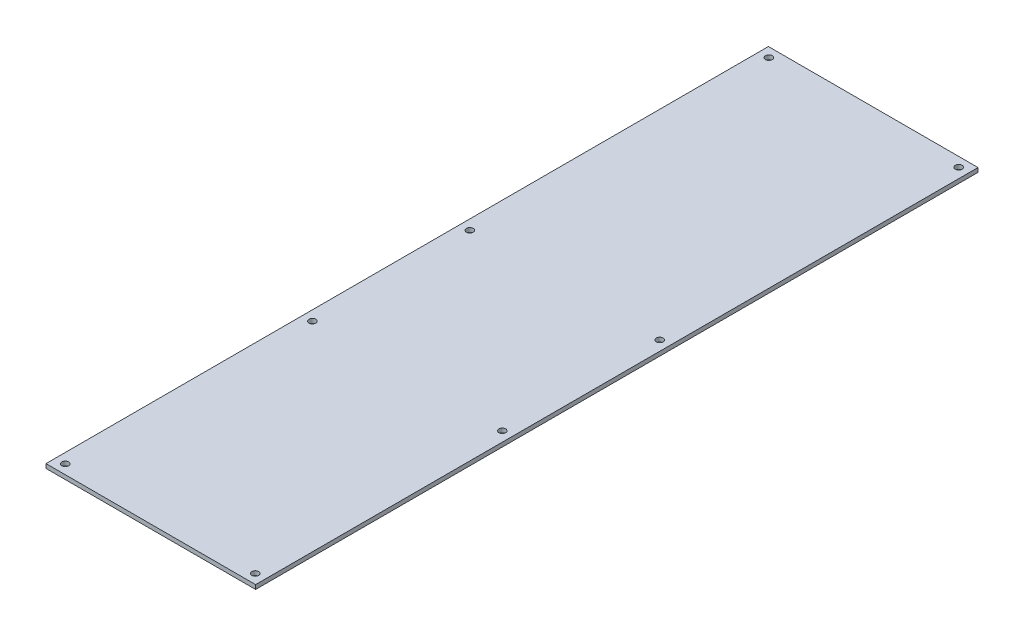
ISO-10303-21;
HEADER;
FILE_DESCRIPTION(('STEP AP214'),'2;1');
FILE_NAME('part.step','',(''),(''),'','','');
FILE_SCHEMA(('AUTOMOTIVE_DESIGN { 1 0 10303 214 1 1 1 1 }'));
ENDSEC;
DATA;
#1=APPLICATION_CONTEXT('core data for automotive mechanical design processes');
#2=APPLICATION_PROTOCOL_DEFINITION('international standard','automotive_design',2000,#1);
#3=PRODUCT_CONTEXT('',#1,'mechanical');
#4=PRODUCT('Part','Part','',(#3));
#5=PRODUCT_RELATED_PRODUCT_CATEGORY('part','',(#4));
#6=PRODUCT_DEFINITION_FORMATION('','',#4);
#7=PRODUCT_DEFINITION_CONTEXT('part definition',#1,'design');
#8=PRODUCT_DEFINITION('design','',#6,#7);
#9=PRODUCT_DEFINITION_SHAPE('','',#8);
#10=(LENGTH_UNIT() NAMED_UNIT(*) SI_UNIT(.MILLI.,.METRE.));
#11=(NAMED_UNIT(*) PLANE_ANGLE_UNIT() SI_UNIT($,.RADIAN.));
#12=(NAMED_UNIT(*) SI_UNIT($,.STERADIAN.) SOLID_ANGLE_UNIT());
#13=UNCERTAINTY_MEASURE_WITH_UNIT(LENGTH_MEASURE(1.E-05),#10,'distance_accuracy_value','');
#14=(GEOMETRIC_REPRESENTATION_CONTEXT(3) GLOBAL_UNCERTAINTY_ASSIGNED_CONTEXT((#13)) GLOBAL_UNIT_ASSIGNED_CONTEXT((#10,
#11,#12)) REPRESENTATION_CONTEXT('',''));
#15=CARTESIAN_POINT('',(0.,0.,0.));
#16=DIRECTION('',(0.,0.,1.));
#17=DIRECTION('',(1.,0.,0.));
#18=AXIS2_PLACEMENT_3D('',#15,#16,#17);
#19=CARTESIAN_POINT('',(0.,1.8,0.));
#20=DIRECTION('',(1.,0.,0.));
#21=DIRECTION('',(0.,0.,-1.));
#22=AXIS2_PLACEMENT_3D('',#19,#20,#21);
#23=PLANE('',#22);
#24=DIRECTION('',(0.,0.,1.));
#25=VECTOR('',#24,1.);
#26=CARTESIAN_POINT('',(0.,0.,0.));
#27=LINE('',#26,#25);
#28=CARTESIAN_POINT('',(0.,0.,0.));
#29=VERTEX_POINT('',#28);
#30=CARTESIAN_POINT('',(0.,0.,307.5));
#31=VERTEX_POINT('',#30);
#32=EDGE_CURVE('E95',#29,#31,#27,.T.);
#33=ORIENTED_EDGE('',*,*,#32,.T.);
#34=DIRECTION('',(0.,-1.,0.));
#35=VECTOR('',#34,1.);
#36=CARTESIAN_POINT('',(0.,1.8,307.5));
#37=LINE('',#36,#35);
#38=CARTESIAN_POINT('',(0.,1.8,307.5));
#39=VERTEX_POINT('',#38);
#40=EDGE_CURVE('E11',#39,#31,#37,.T.);
#41=ORIENTED_EDGE('',*,*,#40,.F.);
#42=DIRECTION('',(0.,0.,1.));
#43=VECTOR('',#42,1.);
#44=CARTESIAN_POINT('',(0.,1.8,0.));
#45=LINE('',#44,#43);
#46=CARTESIAN_POINT('',(0.,1.8,0.));
#47=VERTEX_POINT('',#46);
#48=EDGE_CURVE('E83',#47,#39,#45,.T.);
#49=ORIENTED_EDGE('',*,*,#48,.F.);
#50=DIRECTION('',(0.,-1.,0.));
#51=VECTOR('',#50,1.);
#52=CARTESIAN_POINT('',(0.,1.8,0.));
#53=LINE('',#52,#51);
#54=EDGE_CURVE('E91',#47,#29,#53,.T.);
#55=ORIENTED_EDGE('',*,*,#54,.T.);
#56=EDGE_LOOP('',(#33,#41,#49,#55));
#57=FACE_BOUND('',#56,.T.);
#58=ADVANCED_FACE('F32',(#57),#23,.F.);
#59=CARTESIAN_POINT('',(0.,1.8,307.5));
#60=DIRECTION('',(0.,0.,-1.));
#61=DIRECTION('',(-1.,0.,0.));
#62=AXIS2_PLACEMENT_3D('',#59,#60,#61);
#63=PLANE('',#62);
#64=DIRECTION('',(1.,0.,0.));
#65=VECTOR('',#64,1.);
#66=CARTESIAN_POINT('',(0.,0.,307.5));
#67=LINE('',#66,#65);
#68=CARTESIAN_POINT('',(89.225,0.,307.5));
#69=VERTEX_POINT('',#68);
#70=EDGE_CURVE('E87',#31,#69,#67,.T.);
#71=ORIENTED_EDGE('',*,*,#70,.T.);
#72=DIRECTION('',(0.,-1.,0.));
#73=VECTOR('',#72,1.);
#74=CARTESIAN_POINT('',(89.225,1.8,307.5));
#75=LINE('',#74,#73);
#76=CARTESIAN_POINT('',(89.225,1.8,307.5));
#77=VERTEX_POINT('',#76);
#78=EDGE_CURVE('E40',#77,#69,#75,.T.);
#79=ORIENTED_EDGE('',*,*,#78,.F.);
#80=DIRECTION('',(1.,0.,0.));
#81=VECTOR('',#80,1.);
#82=CARTESIAN_POINT('',(0.,1.8,307.5));
#83=LINE('',#82,#81);
#84=EDGE_CURVE('E78',#39,#77,#83,.T.);
#85=ORIENTED_EDGE('',*,*,#84,.F.);
#86=ORIENTED_EDGE('',*,*,#40,.T.);
#87=EDGE_LOOP('',(#71,#79,#85,#86));
#88=FACE_BOUND('',#87,.T.);
#89=ADVANCED_FACE('F86',(#88),#63,.F.);
#90=CARTESIAN_POINT('',(89.225,1.8,0.));
#91=DIRECTION('',(-1.,0.,0.));
#92=DIRECTION('',(0.,0.,1.));
#93=AXIS2_PLACEMENT_3D('',#90,#91,#92);
#94=PLANE('',#93);
#95=DIRECTION('',(0.,0.,-1.));
#96=VECTOR('',#95,1.);
#97=CARTESIAN_POINT('',(89.225,0.,0.));
#98=LINE('',#97,#96);
#99=CARTESIAN_POINT('',(89.225,0.,0.));
#100=VERTEX_POINT('',#99);
#101=EDGE_CURVE('E65',#69,#100,#98,.T.);
#102=ORIENTED_EDGE('',*,*,#101,.T.);
#103=DIRECTION('',(0.,-1.,0.));
#104=VECTOR('',#103,1.);
#105=CARTESIAN_POINT('',(89.225,1.8,0.));
#106=LINE('',#105,#104);
#107=CARTESIAN_POINT('',(89.225,1.8,0.));
#108=VERTEX_POINT('',#107);
#109=EDGE_CURVE('E88',#108,#100,#106,.T.);
#110=ORIENTED_EDGE('',*,*,#109,.F.);
#111=DIRECTION('',(0.,0.,-1.));
#112=VECTOR('',#111,1.);
#113=CARTESIAN_POINT('',(89.225,1.8,0.));
#114=LINE('',#113,#112);
#115=EDGE_CURVE('E81',#77,#108,#114,.T.);
#116=ORIENTED_EDGE('',*,*,#115,.F.);
#117=ORIENTED_EDGE('',*,*,#78,.T.);
#118=EDGE_LOOP('',(#102,#110,#116,#117));
#119=FACE_BOUND('',#118,.T.);
#120=ADVANCED_FACE('F89',(#119),#94,.F.);
#121=CARTESIAN_POINT('',(0.,1.8,0.));
#122=DIRECTION('',(0.,0.,1.));
#123=DIRECTION('',(1.,0.,0.));
#124=AXIS2_PLACEMENT_3D('',#121,#122,#123);
#125=PLANE('',#124);
#126=DIRECTION('',(-1.,0.,0.));
#127=VECTOR('',#126,1.);
#128=CARTESIAN_POINT('',(0.,0.,0.));
#129=LINE('',#128,#127);
#130=EDGE_CURVE('E71',#100,#29,#129,.T.);
#131=ORIENTED_EDGE('',*,*,#130,.T.);
#132=ORIENTED_EDGE('',*,*,#54,.F.);
#133=DIRECTION('',(-1.,0.,0.));
#134=VECTOR('',#133,1.);
#135=CARTESIAN_POINT('',(0.,1.8,0.));
#136=LINE('',#135,#134);
#137=EDGE_CURVE('E48',#108,#47,#136,.T.);
#138=ORIENTED_EDGE('',*,*,#137,.F.);
#139=ORIENTED_EDGE('',*,*,#109,.T.);
#140=EDGE_LOOP('',(#131,#132,#138,#139));
#141=FACE_BOUND('',#140,.T.);
#142=ADVANCED_FACE('F103',(#141),#125,.F.);
#143=CARTESIAN_POINT('',(0.,1.8,0.));
#144=DIRECTION('',(0.,1.,0.));
#145=DIRECTION('',(0.,0.,1.));
#146=AXIS2_PLACEMENT_3D('',#143,#144,#145);
#147=PLANE('',#146);
#148=CARTESIAN_POINT('',(4.2,1.8,4.));
#149=DIRECTION('',(0.,1.,0.));
#150=DIRECTION('',(0.,0.,1.));
#151=AXIS2_PLACEMENT_3D('',#148,#149,#150);
#152=CIRCLE('',#151,1.44999999999999);
#153=CARTESIAN_POINT('',(4.2,1.8,5.44999999999999));
#154=VERTEX_POINT('',#153);
#155=EDGE_CURVE('E153',#154,#154,#152,.T.);
#156=ORIENTED_EDGE('',*,*,#155,.F.);
#157=EDGE_LOOP('',(#156));
#158=FACE_BOUND('',#157,.T.);
#159=CARTESIAN_POINT('',(85.025,1.8,4.));
#160=DIRECTION('',(0.,1.,0.));
#161=DIRECTION('',(0.,0.,1.));
#162=AXIS2_PLACEMENT_3D('',#159,#160,#161);
#163=CIRCLE('',#162,1.44999999999999);
#164=CARTESIAN_POINT('',(85.025,1.8,5.45));
#165=VERTEX_POINT('',#164);
#166=EDGE_CURVE('E147',#165,#165,#163,.T.);
#167=ORIENTED_EDGE('',*,*,#166,.F.);
#168=EDGE_LOOP('',(#167));
#169=FACE_BOUND('',#168,.T.);
#170=CARTESIAN_POINT('',(85.025,1.8,131.3));
#171=DIRECTION('',(0.,1.,0.));
#172=DIRECTION('',(0.,0.,1.));
#173=AXIS2_PLACEMENT_3D('',#170,#171,#172);
#174=CIRCLE('',#173,1.44999999999999);
#175=CARTESIAN_POINT('',(85.025,1.8,132.75));
#176=VERTEX_POINT('',#175);
#177=EDGE_CURVE('E141',#176,#176,#174,.T.);
#178=ORIENTED_EDGE('',*,*,#177,.F.);
#179=EDGE_LOOP('',(#178));
#180=FACE_BOUND('',#179,.T.);
#181=CARTESIAN_POINT('',(85.025,1.8,198.3));
#182=DIRECTION('',(0.,1.,0.));
#183=DIRECTION('',(0.,0.,1.));
#184=AXIS2_PLACEMENT_3D('',#181,#182,#183);
#185=CIRCLE('',#184,1.44999999999999);
#186=CARTESIAN_POINT('',(85.025,1.8,199.75));
#187=VERTEX_POINT('',#186);
#188=EDGE_CURVE('E135',#187,#187,#185,.T.);
#189=ORIENTED_EDGE('',*,*,#188,.F.);
#190=EDGE_LOOP('',(#189));
#191=FACE_BOUND('',#190,.T.);
#192=CARTESIAN_POINT('',(85.025,1.8,303.5));
#193=DIRECTION('',(0.,1.,0.));
#194=DIRECTION('',(0.,0.,1.));
#195=AXIS2_PLACEMENT_3D('',#192,#193,#194);
#196=CIRCLE('',#195,1.44999999999999);
#197=CARTESIAN_POINT('',(85.025,1.8,304.95));
#198=VERTEX_POINT('',#197);
#199=EDGE_CURVE('E129',#198,#198,#196,.T.);
#200=ORIENTED_EDGE('',*,*,#199,.F.);
#201=EDGE_LOOP('',(#200));
#202=FACE_BOUND('',#201,.T.);
#203=CARTESIAN_POINT('',(4.2,1.8,303.5));
#204=DIRECTION('',(0.,1.,0.));
#205=DIRECTION('',(0.,0.,1.));
#206=AXIS2_PLACEMENT_3D('',#203,#204,#205);
#207=CIRCLE('',#206,1.44999999999999);
#208=CARTESIAN_POINT('',(4.2,1.8,304.95));
#209=VERTEX_POINT('',#208);
#210=EDGE_CURVE('E123',#209,#209,#207,.T.);
#211=ORIENTED_EDGE('',*,*,#210,.F.);
#212=EDGE_LOOP('',(#211));
#213=FACE_BOUND('',#212,.T.);
#214=CARTESIAN_POINT('',(4.2,1.8,198.3));
#215=DIRECTION('',(0.,1.,0.));
#216=DIRECTION('',(0.,0.,1.));
#217=AXIS2_PLACEMENT_3D('',#214,#215,#216);
#218=CIRCLE('',#217,1.44999999999999);
#219=CARTESIAN_POINT('',(4.2,1.8,199.75));
#220=VERTEX_POINT('',#219);
#221=EDGE_CURVE('E117',#220,#220,#218,.T.);
#222=ORIENTED_EDGE('',*,*,#221,.F.);
#223=EDGE_LOOP('',(#222));
#224=FACE_BOUND('',#223,.T.);
#225=CARTESIAN_POINT('',(4.2,1.8,131.3));
#226=DIRECTION('',(0.,1.,0.));
#227=DIRECTION('',(0.,0.,1.));
#228=AXIS2_PLACEMENT_3D('',#225,#226,#227);
#229=CIRCLE('',#228,1.44999999999999);
#230=CARTESIAN_POINT('',(4.2,1.8,132.75));
#231=VERTEX_POINT('',#230);
#232=EDGE_CURVE('E111',#231,#231,#229,.T.);
#233=ORIENTED_EDGE('',*,*,#232,.F.);
#234=EDGE_LOOP('',(#233));
#235=FACE_BOUND('',#234,.T.);
#236=ORIENTED_EDGE('',*,*,#48,.T.);
#237=ORIENTED_EDGE('',*,*,#84,.T.);
#238=ORIENTED_EDGE('',*,*,#115,.T.);
#239=ORIENTED_EDGE('',*,*,#137,.T.);
#240=EDGE_LOOP('',(#236,#237,#238,#239));
#241=FACE_BOUND('',#240,.T.);
#242=ADVANCED_FACE('F79',(#158,#169,#180,#191,#202,#213,#224,#235,#241),#147,.T.);
#243=CARTESIAN_POINT('',(0.,0.,0.));
#244=DIRECTION('',(0.,1.,0.));
#245=DIRECTION('',(0.,0.,1.));
#246=AXIS2_PLACEMENT_3D('',#243,#244,#245);
#247=PLANE('',#246);
#248=CARTESIAN_POINT('',(4.2,0.,4.));
#249=DIRECTION('',(0.,1.,0.));
#250=DIRECTION('',(0.,0.,1.));
#251=AXIS2_PLACEMENT_3D('',#248,#249,#250);
#252=CIRCLE('',#251,1.44999999999999);
#253=CARTESIAN_POINT('',(4.2,0.,5.44999999999999));
#254=VERTEX_POINT('',#253);
#255=EDGE_CURVE('E150',#254,#254,#252,.T.);
#256=ORIENTED_EDGE('',*,*,#255,.T.);
#257=EDGE_LOOP('',(#256));
#258=FACE_BOUND('',#257,.T.);
#259=CARTESIAN_POINT('',(85.025,0.,4.));
#260=DIRECTION('',(0.,1.,0.));
#261=DIRECTION('',(0.,0.,1.));
#262=AXIS2_PLACEMENT_3D('',#259,#260,#261);
#263=CIRCLE('',#262,1.44999999999999);
#264=CARTESIAN_POINT('',(85.025,0.,5.45));
#265=VERTEX_POINT('',#264);
#266=EDGE_CURVE('E144',#265,#265,#263,.T.);
#267=ORIENTED_EDGE('',*,*,#266,.T.);
#268=EDGE_LOOP('',(#267));
#269=FACE_BOUND('',#268,.T.);
#270=CARTESIAN_POINT('',(85.025,0.,131.3));
#271=DIRECTION('',(0.,1.,0.));
#272=DIRECTION('',(0.,0.,1.));
#273=AXIS2_PLACEMENT_3D('',#270,#271,#272);
#274=CIRCLE('',#273,1.44999999999999);
#275=CARTESIAN_POINT('',(85.025,0.,132.75));
#276=VERTEX_POINT('',#275);
#277=EDGE_CURVE('E138',#276,#276,#274,.T.);
#278=ORIENTED_EDGE('',*,*,#277,.T.);
#279=EDGE_LOOP('',(#278));
#280=FACE_BOUND('',#279,.T.);
#281=CARTESIAN_POINT('',(85.025,0.,198.3));
#282=DIRECTION('',(0.,1.,0.));
#283=DIRECTION('',(0.,0.,1.));
#284=AXIS2_PLACEMENT_3D('',#281,#282,#283);
#285=CIRCLE('',#284,1.44999999999999);
#286=CARTESIAN_POINT('',(85.025,0.,199.75));
#287=VERTEX_POINT('',#286);
#288=EDGE_CURVE('E132',#287,#287,#285,.T.);
#289=ORIENTED_EDGE('',*,*,#288,.T.);
#290=EDGE_LOOP('',(#289));
#291=FACE_BOUND('',#290,.T.);
#292=CARTESIAN_POINT('',(85.025,0.,303.5));
#293=DIRECTION('',(0.,1.,0.));
#294=DIRECTION('',(0.,0.,1.));
#295=AXIS2_PLACEMENT_3D('',#292,#293,#294);
#296=CIRCLE('',#295,1.44999999999999);
#297=CARTESIAN_POINT('',(85.025,0.,304.95));
#298=VERTEX_POINT('',#297);
#299=EDGE_CURVE('E126',#298,#298,#296,.T.);
#300=ORIENTED_EDGE('',*,*,#299,.T.);
#301=EDGE_LOOP('',(#300));
#302=FACE_BOUND('',#301,.T.);
#303=CARTESIAN_POINT('',(4.2,0.,303.5));
#304=DIRECTION('',(0.,1.,0.));
#305=DIRECTION('',(0.,0.,1.));
#306=AXIS2_PLACEMENT_3D('',#303,#304,#305);
#307=CIRCLE('',#306,1.44999999999999);
#308=CARTESIAN_POINT('',(4.2,0.,304.95));
#309=VERTEX_POINT('',#308);
#310=EDGE_CURVE('E120',#309,#309,#307,.T.);
#311=ORIENTED_EDGE('',*,*,#310,.T.);
#312=EDGE_LOOP('',(#311));
#313=FACE_BOUND('',#312,.T.);
#314=CARTESIAN_POINT('',(4.2,0.,198.3));
#315=DIRECTION('',(0.,1.,0.));
#316=DIRECTION('',(0.,0.,1.));
#317=AXIS2_PLACEMENT_3D('',#314,#315,#316);
#318=CIRCLE('',#317,1.44999999999999);
#319=CARTESIAN_POINT('',(4.2,0.,199.75));
#320=VERTEX_POINT('',#319);
#321=EDGE_CURVE('E114',#320,#320,#318,.T.);
#322=ORIENTED_EDGE('',*,*,#321,.T.);
#323=EDGE_LOOP('',(#322));
#324=FACE_BOUND('',#323,.T.);
#325=CARTESIAN_POINT('',(4.2,0.,131.3));
#326=DIRECTION('',(0.,1.,0.));
#327=DIRECTION('',(0.,0.,1.));
#328=AXIS2_PLACEMENT_3D('',#325,#326,#327);
#329=CIRCLE('',#328,1.44999999999999);
#330=CARTESIAN_POINT('',(4.2,0.,132.75));
#331=VERTEX_POINT('',#330);
#332=EDGE_CURVE('E98',#331,#331,#329,.T.);
#333=ORIENTED_EDGE('',*,*,#332,.T.);
#334=EDGE_LOOP('',(#333));
#335=FACE_BOUND('',#334,.T.);
#336=ORIENTED_EDGE('',*,*,#32,.F.);
#337=ORIENTED_EDGE('',*,*,#130,.F.);
#338=ORIENTED_EDGE('',*,*,#101,.F.);
#339=ORIENTED_EDGE('',*,*,#70,.F.);
#340=EDGE_LOOP('',(#336,#337,#338,#339));
#341=FACE_BOUND('',#340,.T.);
#342=ADVANCED_FACE('F106',(#258,#269,#280,#291,#302,#313,#324,#335,#341),#247,.F.);
#343=CARTESIAN_POINT('',(4.2,1.8,131.3));
#344=DIRECTION('',(0.,1.,0.));
#345=DIRECTION('',(0.,0.,1.));
#346=AXIS2_PLACEMENT_3D('',#343,#344,#345);
#347=CYLINDRICAL_SURFACE('',#346,1.44999999999999);
#348=ORIENTED_EDGE('',*,*,#332,.F.);
#349=EDGE_LOOP('',(#348));
#350=FACE_BOUND('',#349,.T.);
#351=ORIENTED_EDGE('',*,*,#232,.T.);
#352=EDGE_LOOP('',(#351));
#353=FACE_BOUND('',#352,.T.);
#354=ADVANCED_FACE('F176',(#350,#353),#347,.F.);
#355=CARTESIAN_POINT('',(4.2,1.8,198.3));
#356=DIRECTION('',(0.,1.,0.));
#357=DIRECTION('',(0.,0.,1.));
#358=AXIS2_PLACEMENT_3D('',#355,#356,#357);
#359=CYLINDRICAL_SURFACE('',#358,1.44999999999999);
#360=ORIENTED_EDGE('',*,*,#321,.F.);
#361=EDGE_LOOP('',(#360));
#362=FACE_BOUND('',#361,.T.);
#363=ORIENTED_EDGE('',*,*,#221,.T.);
#364=EDGE_LOOP('',(#363));
#365=FACE_BOUND('',#364,.T.);
#366=ADVANCED_FACE('F178',(#362,#365),#359,.F.);
#367=CARTESIAN_POINT('',(4.2,1.8,303.5));
#368=DIRECTION('',(0.,1.,0.));
#369=DIRECTION('',(0.,0.,1.));
#370=AXIS2_PLACEMENT_3D('',#367,#368,#369);
#371=CYLINDRICAL_SURFACE('',#370,1.44999999999999);
#372=ORIENTED_EDGE('',*,*,#310,.F.);
#373=EDGE_LOOP('',(#372));
#374=FACE_BOUND('',#373,.T.);
#375=ORIENTED_EDGE('',*,*,#210,.T.);
#376=EDGE_LOOP('',(#375));
#377=FACE_BOUND('',#376,.T.);
#378=ADVANCED_FACE('F185',(#374,#377),#371,.F.);
#379=CARTESIAN_POINT('',(85.025,1.8,303.5));
#380=DIRECTION('',(0.,1.,0.));
#381=DIRECTION('',(0.,0.,1.));
#382=AXIS2_PLACEMENT_3D('',#379,#380,#381);
#383=CYLINDRICAL_SURFACE('',#382,1.44999999999999);
#384=ORIENTED_EDGE('',*,*,#299,.F.);
#385=EDGE_LOOP('',(#384));
#386=FACE_BOUND('',#385,.T.);
#387=ORIENTED_EDGE('',*,*,#199,.T.);
#388=EDGE_LOOP('',(#387));
#389=FACE_BOUND('',#388,.T.);
#390=ADVANCED_FACE('F232',(#386,#389),#383,.F.);
#391=CARTESIAN_POINT('',(85.025,1.8,198.3));
#392=DIRECTION('',(0.,1.,0.));
#393=DIRECTION('',(0.,0.,1.));
#394=AXIS2_PLACEMENT_3D('',#391,#392,#393);
#395=CYLINDRICAL_SURFACE('',#394,1.44999999999999);
#396=ORIENTED_EDGE('',*,*,#288,.F.);
#397=EDGE_LOOP('',(#396));
#398=FACE_BOUND('',#397,.T.);
#399=ORIENTED_EDGE('',*,*,#188,.T.);
#400=EDGE_LOOP('',(#399));
#401=FACE_BOUND('',#400,.T.);
#402=ADVANCED_FACE('F242',(#398,#401),#395,.F.);
#403=CARTESIAN_POINT('',(85.025,1.8,131.3));
#404=DIRECTION('',(0.,1.,0.));
#405=DIRECTION('',(0.,0.,1.));
#406=AXIS2_PLACEMENT_3D('',#403,#404,#405);
#407=CYLINDRICAL_SURFACE('',#406,1.44999999999999);
#408=ORIENTED_EDGE('',*,*,#277,.F.);
#409=EDGE_LOOP('',(#408));
#410=FACE_BOUND('',#409,.T.);
#411=ORIENTED_EDGE('',*,*,#177,.T.);
#412=EDGE_LOOP('',(#411));
#413=FACE_BOUND('',#412,.T.);
#414=ADVANCED_FACE('F252',(#410,#413),#407,.F.);
#415=CARTESIAN_POINT('',(85.025,1.8,4.));
#416=DIRECTION('',(0.,1.,0.));
#417=DIRECTION('',(0.,0.,1.));
#418=AXIS2_PLACEMENT_3D('',#415,#416,#417);
#419=CYLINDRICAL_SURFACE('',#418,1.44999999999999);
#420=ORIENTED_EDGE('',*,*,#266,.F.);
#421=EDGE_LOOP('',(#420));
#422=FACE_BOUND('',#421,.T.);
#423=ORIENTED_EDGE('',*,*,#166,.T.);
#424=EDGE_LOOP('',(#423));
#425=FACE_BOUND('',#424,.T.);
#426=ADVANCED_FACE('F262',(#422,#425),#419,.F.);
#427=CARTESIAN_POINT('',(4.2,1.8,4.));
#428=DIRECTION('',(0.,1.,0.));
#429=DIRECTION('',(0.,0.,1.));
#430=AXIS2_PLACEMENT_3D('',#427,#428,#429);
#431=CYLINDRICAL_SURFACE('',#430,1.44999999999999);
#432=ORIENTED_EDGE('',*,*,#255,.F.);
#433=EDGE_LOOP('',(#432));
#434=FACE_BOUND('',#433,.T.);
#435=ORIENTED_EDGE('',*,*,#155,.T.);
#436=EDGE_LOOP('',(#435));
#437=FACE_BOUND('',#436,.T.);
#438=ADVANCED_FACE('F157',(#434,#437),#431,.F.);
#439=CLOSED_SHELL('',(#58,#89,#120,#142,#242,#342,#354,#366,#378,#390,#402,#414,#426,#438));
#440=MANIFOLD_SOLID_BREP('B2',#439);
#441=ADVANCED_BREP_SHAPE_REPRESENTATION('',(#18,#440),#14);
#442=SHAPE_DEFINITION_REPRESENTATION(#9,#441);
ENDSEC;
END-ISO-10303-21;
